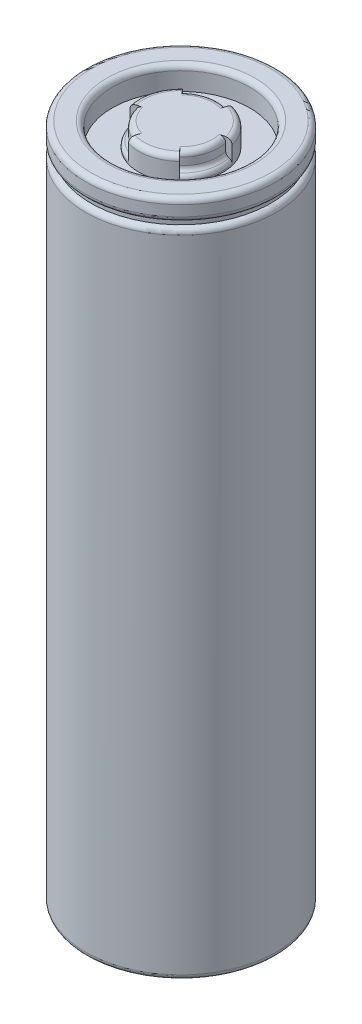
ISO-10303-21;
HEADER;
FILE_DESCRIPTION(('STEP AP214'),'2;1');
FILE_NAME('part.step','',(''),(''),'','','');
FILE_SCHEMA(('AUTOMOTIVE_DESIGN { 1 0 10303 214 1 1 1 1 }'));
ENDSEC;
DATA;
#1=APPLICATION_CONTEXT('core data for automotive mechanical design processes');
#2=APPLICATION_PROTOCOL_DEFINITION('international standard','automotive_design',2000,#1);
#3=PRODUCT_CONTEXT('',#1,'mechanical');
#4=PRODUCT('Part','Part','',(#3));
#5=PRODUCT_RELATED_PRODUCT_CATEGORY('part','',(#4));
#6=PRODUCT_DEFINITION_FORMATION('','',#4);
#7=PRODUCT_DEFINITION_CONTEXT('part definition',#1,'design');
#8=PRODUCT_DEFINITION('design','',#6,#7);
#9=PRODUCT_DEFINITION_SHAPE('','',#8);
#10=(LENGTH_UNIT() NAMED_UNIT(*) SI_UNIT(.MILLI.,.METRE.));
#11=(NAMED_UNIT(*) PLANE_ANGLE_UNIT() SI_UNIT($,.RADIAN.));
#12=(NAMED_UNIT(*) SI_UNIT($,.STERADIAN.) SOLID_ANGLE_UNIT());
#13=UNCERTAINTY_MEASURE_WITH_UNIT(LENGTH_MEASURE(1.E-05),#10,'distance_accuracy_value','');
#14=(GEOMETRIC_REPRESENTATION_CONTEXT(3) GLOBAL_UNCERTAINTY_ASSIGNED_CONTEXT((#13)) GLOBAL_UNIT_ASSIGNED_CONTEXT((#10,
#11,#12)) REPRESENTATION_CONTEXT('',''));
#15=CARTESIAN_POINT('',(0.,0.,0.));
#16=DIRECTION('',(0.,0.,1.));
#17=DIRECTION('',(1.,0.,0.));
#18=AXIS2_PLACEMENT_3D('',#15,#16,#17);
#19=CARTESIAN_POINT('',(-3.1424287856072,-5.68965517241379,0.));
#20=DIRECTION('',(0.,-1.,0.));
#21=DIRECTION('',(0.,0.,-1.));
#22=AXIS2_PLACEMENT_3D('',#19,#20,#21);
#23=PLANE('',#22);
#24=CARTESIAN_POINT('',(-12.1424287856072,-5.68965517241379,0.));
#25=DIRECTION('',(0.,-1.,0.));
#26=DIRECTION('',(0.,0.,-1.));
#27=AXIS2_PLACEMENT_3D('',#24,#25,#26);
#28=CIRCLE('',#27,8.5);
#29=CARTESIAN_POINT('',(-12.1424287856072,-5.68965517241379,-8.5));
#30=VERTEX_POINT('',#29);
#31=EDGE_CURVE('E345',#30,#30,#28,.T.);
#32=ORIENTED_EDGE('',*,*,#31,.T.);
#33=EDGE_LOOP('',(#32));
#34=FACE_BOUND('',#33,.T.);
#35=ADVANCED_FACE('F35',(#34),#23,.T.);
#36=CARTESIAN_POINT('',(-12.1424287856072,58.3103448275862,0.));
#37=DIRECTION('',(0.,1.,0.));
#38=DIRECTION('',(0.,0.,1.));
#39=AXIS2_PLACEMENT_3D('',#36,#37,#38);
#40=PLANE('',#39);
#41=CARTESIAN_POINT('',(-12.1424287856072,58.3103448275862,0.));
#42=DIRECTION('',(0.,1.,0.));
#43=DIRECTION('',(0.,0.,1.));
#44=AXIS2_PLACEMENT_3D('',#41,#42,#43);
#45=CIRCLE('',#44,8.5);
#46=CARTESIAN_POINT('',(-12.1424287856072,58.3103448275862,8.5));
#47=VERTEX_POINT('',#46);
#48=EDGE_CURVE('E363',#47,#47,#45,.T.);
#49=ORIENTED_EDGE('',*,*,#48,.T.);
#50=EDGE_LOOP('',(#49));
#51=FACE_BOUND('',#50,.T.);
#52=CARTESIAN_POINT('',(-12.1424287856072,58.3103448275862,0.));
#53=DIRECTION('',(0.,1.,0.));
#54=DIRECTION('',(0.,0.,1.));
#55=AXIS2_PLACEMENT_3D('',#52,#53,#54);
#56=CIRCLE('',#55,7.);
#57=CARTESIAN_POINT('',(-12.1424287856072,58.3103448275862,7.));
#58=VERTEX_POINT('',#57);
#59=EDGE_CURVE('E360',#58,#58,#56,.F.);
#60=ORIENTED_EDGE('',*,*,#59,.T.);
#61=EDGE_LOOP('',(#60));
#62=FACE_BOUND('',#61,.T.);
#63=ADVANCED_FACE('F459',(#51,#62),#40,.T.);
#64=CARTESIAN_POINT('',(-12.1424287856072,-5.6896551724138,0.));
#65=DIRECTION('',(0.,-1.,0.));
#66=DIRECTION('',(0.,0.,-1.));
#67=AXIS2_PLACEMENT_3D('',#64,#65,#66);
#68=CYLINDRICAL_SURFACE('',#67,9.);
#69=CARTESIAN_POINT('',(-12.1424287856072,57.8103448275862,0.));
#70=DIRECTION('',(0.,1.,0.));
#71=DIRECTION('',(0.,0.,1.));
#72=AXIS2_PLACEMENT_3D('',#69,#70,#71);
#73=CIRCLE('',#72,9.);
#74=CARTESIAN_POINT('',(-12.1424287856072,57.8103448275862,9.));
#75=VERTEX_POINT('',#74);
#76=EDGE_CURVE('E357',#75,#75,#73,.F.);
#77=ORIENTED_EDGE('',*,*,#76,.T.);
#78=EDGE_LOOP('',(#77));
#79=FACE_BOUND('',#78,.T.);
#80=CARTESIAN_POINT('',(-12.1424287856072,56.8103448275862,0.));
#81=DIRECTION('',(0.,-1.,0.));
#82=DIRECTION('',(0.,0.,-1.));
#83=AXIS2_PLACEMENT_3D('',#80,#81,#82);
#84=CIRCLE('',#83,9.);
#85=CARTESIAN_POINT('',(-12.1424287856072,56.8103448275862,-9.));
#86=VERTEX_POINT('',#85);
#87=EDGE_CURVE('E354',#86,#86,#84,.F.);
#88=ORIENTED_EDGE('',*,*,#87,.T.);
#89=EDGE_LOOP('',(#88));
#90=FACE_BOUND('',#89,.T.);
#91=ADVANCED_FACE('F465',(#79,#90),#68,.T.);
#92=CARTESIAN_POINT('',(-12.1424287856072,-5.6896551724138,0.));
#93=DIRECTION('',(0.,-1.,0.));
#94=DIRECTION('',(0.,0.,-1.));
#95=AXIS2_PLACEMENT_3D('',#92,#93,#94);
#96=CYLINDRICAL_SURFACE('',#95,8.5);
#97=CARTESIAN_POINT('',(-12.1424287856072,56.3103448275862,0.));
#98=DIRECTION('',(0.,-1.,0.));
#99=DIRECTION('',(0.,0.,-1.));
#100=AXIS2_PLACEMENT_3D('',#97,#98,#99);
#101=CIRCLE('',#100,8.5);
#102=CARTESIAN_POINT('',(-12.1424287856072,56.3103448275862,-8.5));
#103=VERTEX_POINT('',#102);
#104=EDGE_CURVE('E342',#103,#103,#101,.T.);
#105=ORIENTED_EDGE('',*,*,#104,.T.);
#106=EDGE_LOOP('',(#105));
#107=FACE_BOUND('',#106,.T.);
#108=CARTESIAN_POINT('',(-12.1424287856072,55.8103448275862,0.));
#109=DIRECTION('',(0.,-1.,0.));
#110=DIRECTION('',(0.,0.,-1.));
#111=AXIS2_PLACEMENT_3D('',#108,#109,#110);
#112=CIRCLE('',#111,8.5);
#113=CARTESIAN_POINT('',(-12.1424287856072,55.8103448275862,-8.5));
#114=VERTEX_POINT('',#113);
#115=EDGE_CURVE('E339',#114,#114,#112,.T.);
#116=ORIENTED_EDGE('',*,*,#115,.F.);
#117=EDGE_LOOP('',(#116));
#118=FACE_BOUND('',#117,.T.);
#119=ADVANCED_FACE('F588',(#107,#118),#96,.T.);
#120=CARTESIAN_POINT('',(-12.1424287856072,-5.6896551724138,0.));
#121=DIRECTION('',(0.,-1.,0.));
#122=DIRECTION('',(0.,0.,-1.));
#123=AXIS2_PLACEMENT_3D('',#120,#121,#122);
#124=CYLINDRICAL_SURFACE('',#123,9.);
#125=CARTESIAN_POINT('',(-12.1424287856072,55.3103448275862,0.));
#126=DIRECTION('',(0.,1.,0.));
#127=DIRECTION('',(0.,0.,1.));
#128=AXIS2_PLACEMENT_3D('',#125,#126,#127);
#129=CIRCLE('',#128,9.);
#130=CARTESIAN_POINT('',(-12.1424287856072,55.3103448275862,9.));
#131=VERTEX_POINT('',#130);
#132=EDGE_CURVE('E351',#131,#131,#129,.F.);
#133=ORIENTED_EDGE('',*,*,#132,.T.);
#134=EDGE_LOOP('',(#133));
#135=FACE_BOUND('',#134,.T.);
#136=CARTESIAN_POINT('',(-12.1424287856072,-5.18965517241379,0.));
#137=DIRECTION('',(0.,-1.,0.));
#138=DIRECTION('',(0.,0.,-1.));
#139=AXIS2_PLACEMENT_3D('',#136,#137,#138);
#140=CIRCLE('',#139,9.);
#141=CARTESIAN_POINT('',(-12.1424287856072,-5.18965517241379,-9.));
#142=VERTEX_POINT('',#141);
#143=EDGE_CURVE('E348',#142,#142,#140,.F.);
#144=ORIENTED_EDGE('',*,*,#143,.T.);
#145=EDGE_LOOP('',(#144));
#146=FACE_BOUND('',#145,.T.);
#147=ADVANCED_FACE('F474',(#135,#146),#124,.T.);
#148=CARTESIAN_POINT('',(-12.1424287856072,-5.18965517241379,0.));
#149=DIRECTION('',(0.,-1.,0.));
#150=DIRECTION('',(0.,0.,-1.));
#151=AXIS2_PLACEMENT_3D('',#148,#149,#150);
#152=TOROIDAL_SURFACE('',#151,8.5,0.5);
#153=ORIENTED_EDGE('',*,*,#143,.F.);
#154=EDGE_LOOP('',(#153));
#155=FACE_BOUND('',#154,.T.);
#156=ORIENTED_EDGE('',*,*,#31,.F.);
#157=EDGE_LOOP('',(#156));
#158=FACE_BOUND('',#157,.T.);
#159=ADVANCED_FACE('F470',(#155,#158),#152,.T.);
#160=CARTESIAN_POINT('',(-12.1424287856072,55.3103448275862,0.));
#161=DIRECTION('',(0.,1.,0.));
#162=DIRECTION('',(0.,0.,1.));
#163=AXIS2_PLACEMENT_3D('',#160,#161,#162);
#164=TOROIDAL_SURFACE('',#163,8.5,0.5);
#165=ORIENTED_EDGE('',*,*,#115,.T.);
#166=EDGE_LOOP('',(#165));
#167=FACE_BOUND('',#166,.T.);
#168=ORIENTED_EDGE('',*,*,#132,.F.);
#169=EDGE_LOOP('',(#168));
#170=FACE_BOUND('',#169,.T.);
#171=ADVANCED_FACE('F473',(#167,#170),#164,.T.);
#172=CARTESIAN_POINT('',(-12.1424287856072,56.8103448275862,0.));
#173=DIRECTION('',(0.,-1.,0.));
#174=DIRECTION('',(0.,0.,-1.));
#175=AXIS2_PLACEMENT_3D('',#172,#173,#174);
#176=TOROIDAL_SURFACE('',#175,8.5,0.5);
#177=ORIENTED_EDGE('',*,*,#87,.F.);
#178=EDGE_LOOP('',(#177));
#179=FACE_BOUND('',#178,.T.);
#180=ORIENTED_EDGE('',*,*,#104,.F.);
#181=EDGE_LOOP('',(#180));
#182=FACE_BOUND('',#181,.T.);
#183=ADVANCED_FACE('F478',(#179,#182),#176,.T.);
#184=CARTESIAN_POINT('',(-12.1424287856072,56.1103448275862,0.));
#185=DIRECTION('',(0.,1.,0.));
#186=DIRECTION('',(0.,0.,1.));
#187=AXIS2_PLACEMENT_3D('',#184,#185,#186);
#188=CYLINDRICAL_SURFACE('',#187,6.5);
#189=CARTESIAN_POINT('',(-12.1424287856072,57.8103448275862,0.));
#190=DIRECTION('',(0.,1.,0.));
#191=DIRECTION('',(0.,0.,1.));
#192=AXIS2_PLACEMENT_3D('',#189,#190,#191);
#193=CIRCLE('',#192,6.5);
#194=CARTESIAN_POINT('',(-12.1424287856072,57.8103448275862,6.5));
#195=VERTEX_POINT('',#194);
#196=EDGE_CURVE('E366',#195,#195,#193,.T.);
#197=ORIENTED_EDGE('',*,*,#196,.T.);
#198=EDGE_LOOP('',(#197));
#199=FACE_BOUND('',#198,.T.);
#200=CARTESIAN_POINT('',(-12.1424287856072,56.1103448275862,0.));
#201=DIRECTION('',(0.,1.,0.));
#202=DIRECTION('',(0.,0.,1.));
#203=AXIS2_PLACEMENT_3D('',#200,#201,#202);
#204=CIRCLE('',#203,6.5);
#205=CARTESIAN_POINT('',(-12.1424287856072,56.1103448275862,6.5));
#206=VERTEX_POINT('',#205);
#207=EDGE_CURVE('E336',#206,#206,#204,.T.);
#208=ORIENTED_EDGE('',*,*,#207,.F.);
#209=EDGE_LOOP('',(#208));
#210=FACE_BOUND('',#209,.T.);
#211=ADVANCED_FACE('F482',(#199,#210),#188,.F.);
#212=CARTESIAN_POINT('',(-12.1424287856072,56.1103448275862,0.));
#213=DIRECTION('',(0.,1.,0.));
#214=DIRECTION('',(0.,0.,1.));
#215=AXIS2_PLACEMENT_3D('',#212,#213,#214);
#216=PLANE('',#215);
#217=CARTESIAN_POINT('',(-12.1424287856072,56.1103448275862,0.));
#218=DIRECTION('',(0.,1.,0.));
#219=DIRECTION('',(0.,0.,1.));
#220=AXIS2_PLACEMENT_3D('',#217,#218,#219);
#221=CIRCLE('',#220,4.);
#222=CARTESIAN_POINT('',(-12.1424287856072,56.1103448275862,4.));
#223=VERTEX_POINT('',#222);
#224=EDGE_CURVE('E325',#223,#223,#221,.T.);
#225=ORIENTED_EDGE('',*,*,#224,.F.);
#226=EDGE_LOOP('',(#225));
#227=FACE_BOUND('',#226,.T.);
#228=ORIENTED_EDGE('',*,*,#207,.T.);
#229=EDGE_LOOP('',(#228));
#230=FACE_BOUND('',#229,.T.);
#231=ADVANCED_FACE('F566',(#227,#230),#216,.T.);
#232=CARTESIAN_POINT('',(-12.1424287856072,69.624053326571,0.));
#233=DIRECTION('',(0.,-1.,0.));
#234=DIRECTION('',(0.,0.,-1.));
#235=AXIS2_PLACEMENT_3D('',#232,#233,#234);
#236=CYLINDRICAL_SURFACE('',#235,4.);
#237=CARTESIAN_POINT('',(-12.1424287856072,56.2443194238015,0.));
#238=DIRECTION('',(0.,1.,0.));
#239=DIRECTION('',(0.,0.,1.));
#240=AXIS2_PLACEMENT_3D('',#237,#238,#239);
#241=CIRCLE('',#240,4.);
#242=CARTESIAN_POINT('',(-8.25454744926253,56.2443194238015,-0.940414118621564));
#243=VERTEX_POINT('',#242);
#244=CARTESIAN_POINT('',(-9.38406560063104,56.2443194238015,2.8967969448631));
#245=VERTEX_POINT('',#244);
#246=EDGE_CURVE('E288',#243,#245,#241,.F.);
#247=ORIENTED_EDGE('',*,*,#246,.T.);
#248=DIRECTION('',(0.,1.,0.));
#249=VECTOR('',#248,1.);
#250=CARTESIAN_POINT('',(-9.38406560063104,56.6103448275862,2.8967969448631));
#251=LINE('',#250,#249);
#252=CARTESIAN_POINT('',(-9.38406560063104,57.8103448275862,2.8967969448631));
#253=VERTEX_POINT('',#252);
#254=EDGE_CURVE('E323',#245,#253,#251,.T.);
#255=ORIENTED_EDGE('',*,*,#254,.T.);
#256=CARTESIAN_POINT('',(-12.1424287856072,57.8103448275862,0.));
#257=DIRECTION('',(0.,1.,0.));
#258=DIRECTION('',(0.,0.,1.));
#259=AXIS2_PLACEMENT_3D('',#256,#257,#258);
#260=CIRCLE('',#259,4.);
#261=CARTESIAN_POINT('',(-13.2719469369757,57.8103448275862,3.83721106348467));
#262=VERTEX_POINT('',#261);
#263=EDGE_CURVE('E229',#253,#262,#260,.F.);
#264=ORIENTED_EDGE('',*,*,#263,.T.);
#265=DIRECTION('',(0.,1.,0.));
#266=VECTOR('',#265,1.);
#267=CARTESIAN_POINT('',(-13.2719469369757,56.6103448275862,3.83721106348467));
#268=LINE('',#267,#266);
#269=CARTESIAN_POINT('',(-13.2719469369757,56.2443194238015,3.83721106348467));
#270=VERTEX_POINT('',#269);
#271=EDGE_CURVE('E186',#270,#262,#268,.T.);
#272=ORIENTED_EDGE('',*,*,#271,.F.);
#273=CARTESIAN_POINT('',(-12.1424287856072,56.2443194238015,0.));
#274=DIRECTION('',(0.,1.,0.));
#275=DIRECTION('',(0.,0.,1.));
#276=AXIS2_PLACEMENT_3D('',#273,#274,#275);
#277=CIRCLE('',#276,4.);
#278=CARTESIAN_POINT('',(-16.0303101219519,56.2443194238015,0.940414118621601));
#279=VERTEX_POINT('',#278);
#280=EDGE_CURVE('E285',#270,#279,#277,.F.);
#281=ORIENTED_EDGE('',*,*,#280,.T.);
#282=DIRECTION('',(0.,1.,0.));
#283=VECTOR('',#282,1.);
#284=CARTESIAN_POINT('',(-16.0303101219519,56.6103448275862,0.940414118621601));
#285=LINE('',#284,#283);
#286=CARTESIAN_POINT('',(-16.0303101219519,57.8103448275862,0.940414118621601));
#287=VERTEX_POINT('',#286);
#288=EDGE_CURVE('E314',#279,#287,#285,.T.);
#289=ORIENTED_EDGE('',*,*,#288,.T.);
#290=CARTESIAN_POINT('',(-12.1424287856072,57.8103448275862,0.));
#291=DIRECTION('',(0.,1.,0.));
#292=DIRECTION('',(0.,0.,1.));
#293=AXIS2_PLACEMENT_3D('',#290,#291,#292);
#294=CIRCLE('',#293,4.);
#295=CARTESIAN_POINT('',(-14.9007919705834,57.8103448275862,-2.89679694486308));
#296=VERTEX_POINT('',#295);
#297=EDGE_CURVE('E227',#287,#296,#294,.F.);
#298=ORIENTED_EDGE('',*,*,#297,.T.);
#299=DIRECTION('',(0.,1.,0.));
#300=VECTOR('',#299,1.);
#301=CARTESIAN_POINT('',(-14.9007919705834,56.6103448275862,-2.89679694486308));
#302=LINE('',#301,#300);
#303=CARTESIAN_POINT('',(-14.9007919705834,56.2443194238015,-2.89679694486308));
#304=VERTEX_POINT('',#303);
#305=EDGE_CURVE('E391',#304,#296,#302,.T.);
#306=ORIENTED_EDGE('',*,*,#305,.F.);
#307=CARTESIAN_POINT('',(-12.1424287856072,56.2443194238015,0.));
#308=DIRECTION('',(0.,1.,0.));
#309=DIRECTION('',(0.,0.,1.));
#310=AXIS2_PLACEMENT_3D('',#307,#308,#309);
#311=CIRCLE('',#310,4.);
#312=CARTESIAN_POINT('',(-11.0129106342387,56.2443194238015,-3.83721106348466));
#313=VERTEX_POINT('',#312);
#314=EDGE_CURVE('E282',#304,#313,#311,.F.);
#315=ORIENTED_EDGE('',*,*,#314,.T.);
#316=DIRECTION('',(0.,1.,0.));
#317=VECTOR('',#316,1.);
#318=CARTESIAN_POINT('',(-11.0129106342387,56.6103448275862,-3.83721106348467));
#319=LINE('',#318,#317);
#320=CARTESIAN_POINT('',(-11.0129106342387,57.8103448275862,-3.83721106348467));
#321=VERTEX_POINT('',#320);
#322=EDGE_CURVE('E333',#313,#321,#319,.T.);
#323=ORIENTED_EDGE('',*,*,#322,.T.);
#324=CARTESIAN_POINT('',(-12.1424287856072,57.8103448275862,0.));
#325=DIRECTION('',(0.,1.,0.));
#326=DIRECTION('',(0.,0.,1.));
#327=AXIS2_PLACEMENT_3D('',#324,#325,#326);
#328=CIRCLE('',#327,4.);
#329=CARTESIAN_POINT('',(-8.25454744926253,57.8103448275862,-0.940414118621564));
#330=VERTEX_POINT('',#329);
#331=EDGE_CURVE('E231',#321,#330,#328,.F.);
#332=ORIENTED_EDGE('',*,*,#331,.T.);
#333=DIRECTION('',(0.,1.,0.));
#334=VECTOR('',#333,1.);
#335=CARTESIAN_POINT('',(-8.25454744926253,56.6103448275862,-0.940414118621564));
#336=LINE('',#335,#334);
#337=EDGE_CURVE('E330',#243,#330,#336,.T.);
#338=ORIENTED_EDGE('',*,*,#337,.F.);
#339=EDGE_LOOP('',(#247,#255,#264,#272,#281,#289,#298,#306,#315,#323,#332,#338));
#340=FACE_BOUND('',#339,.T.);
#341=ORIENTED_EDGE('',*,*,#224,.T.);
#342=EDGE_LOOP('',(#341));
#343=FACE_BOUND('',#342,.T.);
#344=ADVANCED_FACE('F312',(#340,#343),#236,.T.);
#345=CARTESIAN_POINT('',(-12.1424287856072,58.3103448275862,0.));
#346=DIRECTION('',(0.,1.,0.));
#347=DIRECTION('',(0.,0.,1.));
#348=AXIS2_PLACEMENT_3D('',#345,#346,#347);
#349=PLANE('',#348);
#350=DIRECTION('',(0.971970334086168,0.,-0.23510352965539));
#351=VECTOR('',#350,1.);
#352=CARTESIAN_POINT('',(-12.1424287856072,58.3103448275862,0.));
#353=LINE('',#352,#351);
#354=CARTESIAN_POINT('',(-9.2265177833487,58.3103448275862,-0.705310588966171));
#355=VERTEX_POINT('',#354);
#356=CARTESIAN_POINT('',(-8.74053261630562,58.3103448275862,-0.822862353793869));
#357=VERTEX_POINT('',#356);
#358=EDGE_CURVE('E217',#355,#357,#353,.T.);
#359=ORIENTED_EDGE('',*,*,#358,.T.);
#360=CARTESIAN_POINT('',(-12.1424287856072,58.3103448275862,0.));
#361=DIRECTION('',(0.,1.,0.));
#362=DIRECTION('',(0.,0.,1.));
#363=AXIS2_PLACEMENT_3D('',#360,#361,#362);
#364=CIRCLE('',#363,3.5);
#365=CARTESIAN_POINT('',(-11.1541004031598,58.3103448275862,-3.35755968054908));
#366=VERTEX_POINT('',#365);
#367=EDGE_CURVE('E219',#357,#366,#364,.T.);
#368=ORIENTED_EDGE('',*,*,#367,.T.);
#369=DIRECTION('',(0.282379537842125,0.,-0.959302765871165));
#370=VECTOR('',#369,1.);
#371=CARTESIAN_POINT('',(-12.1424287856072,58.3103448275862,0.));
#372=LINE('',#371,#370);
#373=CARTESIAN_POINT('',(-11.2952901720808,58.3103448275862,-2.8779082976135));
#374=VERTEX_POINT('',#373);
#375=EDGE_CURVE('E214',#366,#374,#372,.F.);
#376=ORIENTED_EDGE('',*,*,#375,.T.);
#377=CARTESIAN_POINT('',(-12.1424287856072,58.3103448275862,0.));
#378=DIRECTION('',(0.,1.,0.));
#379=DIRECTION('',(0.,0.,1.));
#380=AXIS2_PLACEMENT_3D('',#377,#378,#379);
#381=CIRCLE('',#380,3.);
#382=CARTESIAN_POINT('',(-14.2112011743393,58.3103448275862,-2.17259770864731));
#383=VERTEX_POINT('',#382);
#384=EDGE_CURVE('E202',#374,#383,#381,.T.);
#385=ORIENTED_EDGE('',*,*,#384,.T.);
#386=DIRECTION('',(-0.689590796244044,0.,-0.724199236215771));
#387=VECTOR('',#386,1.);
#388=CARTESIAN_POINT('',(-12.1424287856072,58.3103448275862,0.));
#389=LINE('',#388,#387);
#390=CARTESIAN_POINT('',(-14.5559965724614,58.3103448275862,-2.53469732675519));
#391=VERTEX_POINT('',#390);
#392=EDGE_CURVE('E375',#383,#391,#389,.T.);
#393=ORIENTED_EDGE('',*,*,#392,.T.);
#394=CARTESIAN_POINT('',(-12.1424287856072,58.3103448275862,0.));
#395=DIRECTION('',(0.,1.,0.));
#396=DIRECTION('',(0.,0.,1.));
#397=AXIS2_PLACEMENT_3D('',#394,#395,#396);
#398=CIRCLE('',#397,3.5);
#399=CARTESIAN_POINT('',(-15.5443249549088,58.3103448275862,0.822862353793903));
#400=VERTEX_POINT('',#399);
#401=EDGE_CURVE('E369',#391,#400,#398,.T.);
#402=ORIENTED_EDGE('',*,*,#401,.T.);
#403=DIRECTION('',(-0.971970334086166,0.,0.235103529655398));
#404=VECTOR('',#403,1.);
#405=CARTESIAN_POINT('',(-12.1424287856072,58.3103448275862,0.));
#406=LINE('',#405,#404);
#407=CARTESIAN_POINT('',(-15.0583397878657,58.3103448275862,0.705310588966193));
#408=VERTEX_POINT('',#407);
#409=EDGE_CURVE('E372',#400,#408,#406,.F.);
#410=ORIENTED_EDGE('',*,*,#409,.T.);
#411=CARTESIAN_POINT('',(-12.1424287856072,58.3103448275862,0.));
#412=DIRECTION('',(0.,1.,0.));
#413=DIRECTION('',(0.,0.,1.));
#414=AXIS2_PLACEMENT_3D('',#411,#412,#413);
#415=CIRCLE('',#414,3.);
#416=CARTESIAN_POINT('',(-12.9895673991336,58.3103448275862,2.8779082976135));
#417=VERTEX_POINT('',#416);
#418=EDGE_CURVE('E201',#408,#417,#415,.T.);
#419=ORIENTED_EDGE('',*,*,#418,.T.);
#420=DIRECTION('',(-0.282379537842119,0.,0.959302765871167));
#421=VECTOR('',#420,1.);
#422=CARTESIAN_POINT('',(-12.1424287856072,58.3103448275862,0.));
#423=LINE('',#422,#421);
#424=CARTESIAN_POINT('',(-13.1307571680546,58.3103448275862,3.35755968054909));
#425=VERTEX_POINT('',#424);
#426=EDGE_CURVE('E183',#417,#425,#423,.T.);
#427=ORIENTED_EDGE('',*,*,#426,.T.);
#428=CARTESIAN_POINT('',(-12.1424287856072,58.3103448275862,0.));
#429=DIRECTION('',(0.,1.,0.));
#430=DIRECTION('',(0.,0.,1.));
#431=AXIS2_PLACEMENT_3D('',#428,#429,#430);
#432=CIRCLE('',#431,3.5);
#433=CARTESIAN_POINT('',(-9.72886099875306,58.3103448275862,2.53469732675521));
#434=VERTEX_POINT('',#433);
#435=EDGE_CURVE('E198',#425,#434,#432,.T.);
#436=ORIENTED_EDGE('',*,*,#435,.T.);
#437=DIRECTION('',(0.689590796244039,0.,0.724199236215775));
#438=VECTOR('',#437,1.);
#439=CARTESIAN_POINT('',(-12.1424287856072,58.3103448275862,0.));
#440=LINE('',#439,#438);
#441=CARTESIAN_POINT('',(-10.0736563968751,58.3103448275862,2.17259770864733));
#442=VERTEX_POINT('',#441);
#443=EDGE_CURVE('E206',#434,#442,#440,.F.);
#444=ORIENTED_EDGE('',*,*,#443,.T.);
#445=CARTESIAN_POINT('',(-12.1424287856072,58.3103448275862,0.));
#446=DIRECTION('',(0.,1.,0.));
#447=DIRECTION('',(0.,0.,1.));
#448=AXIS2_PLACEMENT_3D('',#445,#446,#447);
#449=CIRCLE('',#448,3.);
#450=EDGE_CURVE('E208',#442,#355,#449,.T.);
#451=ORIENTED_EDGE('',*,*,#450,.T.);
#452=EDGE_LOOP('',(#359,#368,#376,#385,#393,#402,#410,#419,#427,#436,#444,#451));
#453=FACE_BOUND('',#452,.T.);
#454=ADVANCED_FACE('F196',(#453),#349,.T.);
#455=CARTESIAN_POINT('',(-12.1424287856072,57.8103448275862,0.));
#456=DIRECTION('',(0.,1.,0.));
#457=DIRECTION('',(0.,0.,1.));
#458=AXIS2_PLACEMENT_3D('',#455,#456,#457);
#459=TOROIDAL_SURFACE('',#458,8.5,0.5);
#460=ORIENTED_EDGE('',*,*,#48,.F.);
#461=EDGE_LOOP('',(#460));
#462=FACE_BOUND('',#461,.T.);
#463=ORIENTED_EDGE('',*,*,#76,.F.);
#464=EDGE_LOOP('',(#463));
#465=FACE_BOUND('',#464,.T.);
#466=ADVANCED_FACE('F454',(#462,#465),#459,.T.);
#467=CARTESIAN_POINT('',(-12.1424287856072,57.8103448275862,0.));
#468=DIRECTION('',(0.,1.,0.));
#469=DIRECTION('',(0.,0.,1.));
#470=AXIS2_PLACEMENT_3D('',#467,#468,#469);
#471=TOROIDAL_SURFACE('',#470,7.,0.5);
#472=ORIENTED_EDGE('',*,*,#59,.F.);
#473=EDGE_LOOP('',(#472));
#474=FACE_BOUND('',#473,.T.);
#475=ORIENTED_EDGE('',*,*,#196,.F.);
#476=EDGE_LOOP('',(#475));
#477=FACE_BOUND('',#476,.T.);
#478=ADVANCED_FACE('F447',(#474,#477),#471,.T.);
#479=CARTESIAN_POINT('',(-6.36827325146014,56.6103448275862,6.06394263147989));
#480=DIRECTION('',(-0.724199236215775,0.,0.689590796244039));
#481=DIRECTION('',(0.689590796244039,0.,0.724199236215775));
#482=AXIS2_PLACEMENT_3D('',#479,#480,#481);
#483=PLANE('',#482);
#484=ORIENTED_EDGE('',*,*,#254,.F.);
#485=CARTESIAN_POINT('',(-9.72886099875301,56.2443194238015,2.53469732675527));
#486=DIRECTION('',(-0.724199236215775,0.,0.689590796244039));
#487=DIRECTION('',(0.689590796244039,0.,0.724199236215775));
#488=AXIS2_PLACEMENT_3D('',#485,#486,#487);
#489=CIRCLE('',#488,0.5);
#490=CARTESIAN_POINT('',(-9.556463299692,56.6773321256939,2.71574713580921));
#491=VERTEX_POINT('',#490);
#492=EDGE_CURVE('E296',#245,#491,#489,.T.);
#493=ORIENTED_EDGE('',*,*,#492,.T.);
#494=CARTESIAN_POINT('',(-9.38406560063105,57.1103448275862,2.8967969448631));
#495=DIRECTION('',(-0.724199236215775,0.,0.689590796244039));
#496=DIRECTION('',(0.689590796244039,0.,0.724199236215775));
#497=AXIS2_PLACEMENT_3D('',#494,#495,#496);
#498=CIRCLE('',#497,0.5);
#499=CARTESIAN_POINT('',(-9.72886099875306,57.1103448275862,2.53469732675521));
#500=VERTEX_POINT('',#499);
#501=EDGE_CURVE('E272',#491,#500,#498,.F.);
#502=ORIENTED_EDGE('',*,*,#501,.T.);
#503=DIRECTION('',(0.,1.,0.));
#504=VECTOR('',#503,1.);
#505=CARTESIAN_POINT('',(-9.72886099875306,56.6103448275862,2.53469732675521));
#506=LINE('',#505,#504);
#507=CARTESIAN_POINT('',(-9.72886099875306,57.8103448275862,2.53469732675521));
#508=VERTEX_POINT('',#507);
#509=EDGE_CURVE('E326',#500,#508,#506,.T.);
#510=ORIENTED_EDGE('',*,*,#509,.T.);
#511=CARTESIAN_POINT('',(-10.0736563968751,57.8103448275862,2.17259770864733));
#512=DIRECTION('',(-0.724199236215775,0.,0.689590796244039));
#513=DIRECTION('',(0.689590796244039,0.,0.724199236215775));
#514=AXIS2_PLACEMENT_3D('',#511,#512,#513);
#515=CIRCLE('',#514,0.5);
#516=EDGE_CURVE('E253',#508,#442,#515,.T.);
#517=ORIENTED_EDGE('',*,*,#516,.T.);
#518=ORIENTED_EDGE('',*,*,#443,.F.);
#519=CARTESIAN_POINT('',(-9.72886099875307,57.8103448275862,2.53469732675521));
#520=DIRECTION('',(-0.724199236215775,0.,0.689590796244039));
#521=DIRECTION('',(0.689590796244039,0.,0.724199236215775));
#522=AXIS2_PLACEMENT_3D('',#519,#520,#521);
#523=CIRCLE('',#522,0.5);
#524=EDGE_CURVE('E191',#434,#253,#523,.F.);
#525=ORIENTED_EDGE('',*,*,#524,.T.);
#526=EDGE_LOOP('',(#484,#493,#502,#510,#517,#518,#525));
#527=FACE_BOUND('',#526,.T.);
#528=ADVANCED_FACE('F445',(#527),#483,.F.);
#529=CARTESIAN_POINT('',(-12.1424287856072,56.6103448275862,0.));
#530=DIRECTION('',(0.,1.,0.));
#531=DIRECTION('',(0.,0.,1.));
#532=AXIS2_PLACEMENT_3D('',#529,#530,#531);
#533=CYLINDRICAL_SURFACE('',#532,3.5);
#534=ORIENTED_EDGE('',*,*,#509,.F.);
#535=CARTESIAN_POINT('',(-12.1424287856072,57.1103448275862,0.));
#536=DIRECTION('',(0.,1.,0.));
#537=DIRECTION('',(0.,0.,1.));
#538=AXIS2_PLACEMENT_3D('',#535,#536,#537);
#539=CIRCLE('',#538,3.5);
#540=CARTESIAN_POINT('',(-8.74053261630562,57.1103448275862,-0.822862353793869));
#541=VERTEX_POINT('',#540);
#542=EDGE_CURVE('E266',#500,#541,#539,.T.);
#543=ORIENTED_EDGE('',*,*,#542,.T.);
#544=DIRECTION('',(0.,1.,0.));
#545=VECTOR('',#544,1.);
#546=CARTESIAN_POINT('',(-8.74053261630562,56.6103448275862,-0.822862353793869));
#547=LINE('',#546,#545);
#548=CARTESIAN_POINT('',(-8.74053261630562,57.8103448275862,-0.822862353793869));
#549=VERTEX_POINT('',#548);
#550=EDGE_CURVE('E328',#541,#549,#547,.T.);
#551=ORIENTED_EDGE('',*,*,#550,.T.);
#552=CARTESIAN_POINT('',(-12.1424287856072,57.8103448275862,0.));
#553=DIRECTION('',(0.,1.,0.));
#554=DIRECTION('',(0.,0.,1.));
#555=AXIS2_PLACEMENT_3D('',#552,#553,#554);
#556=CIRCLE('',#555,3.5);
#557=EDGE_CURVE('E235',#549,#508,#556,.F.);
#558=ORIENTED_EDGE('',*,*,#557,.T.);
#559=EDGE_LOOP('',(#534,#543,#551,#558));
#560=FACE_BOUND('',#559,.T.);
#561=ADVANCED_FACE('F434',(#560),#533,.T.);
#562=CARTESIAN_POINT('',(-0.671156597522295,56.6103448275862,-2.77471079772419));
#563=DIRECTION('',(0.23510352965539,0.,0.971970334086168));
#564=DIRECTION('',(0.971970334086168,0.,-0.23510352965539));
#565=AXIS2_PLACEMENT_3D('',#562,#563,#564);
#566=PLANE('',#565);
#567=ORIENTED_EDGE('',*,*,#550,.F.);
#568=CARTESIAN_POINT('',(-8.25454744926253,57.1103448275862,-0.940414118621562));
#569=DIRECTION('',(0.23510352965539,0.,0.971970334086168));
#570=DIRECTION('',(0.971970334086168,0.,-0.23510352965539));
#571=AXIS2_PLACEMENT_3D('',#568,#569,#570);
#572=CIRCLE('',#571,0.5);
#573=CARTESIAN_POINT('',(-8.497540032784,56.6773321256939,-0.881638236207732));
#574=VERTEX_POINT('',#573);
#575=EDGE_CURVE('E269',#541,#574,#572,.T.);
#576=ORIENTED_EDGE('',*,*,#575,.T.);
#577=CARTESIAN_POINT('',(-8.74053261630554,56.2443194238015,-0.822862353793885));
#578=DIRECTION('',(0.23510352965539,0.,0.971970334086168));
#579=DIRECTION('',(0.971970334086168,0.,-0.23510352965539));
#580=AXIS2_PLACEMENT_3D('',#577,#578,#579);
#581=CIRCLE('',#580,0.5);
#582=EDGE_CURVE('E298',#574,#243,#581,.F.);
#583=ORIENTED_EDGE('',*,*,#582,.T.);
#584=ORIENTED_EDGE('',*,*,#337,.T.);
#585=CARTESIAN_POINT('',(-8.74053261630561,57.8103448275862,-0.822862353793867));
#586=DIRECTION('',(0.23510352965539,0.,0.971970334086168));
#587=DIRECTION('',(0.971970334086168,0.,-0.23510352965539));
#588=AXIS2_PLACEMENT_3D('',#585,#586,#587);
#589=CIRCLE('',#588,0.5);
#590=EDGE_CURVE('E233',#330,#357,#589,.T.);
#591=ORIENTED_EDGE('',*,*,#590,.T.);
#592=ORIENTED_EDGE('',*,*,#358,.F.);
#593=CARTESIAN_POINT('',(-9.2265177833487,57.8103448275862,-0.705310588966171));
#594=DIRECTION('',(0.23510352965539,0.,0.971970334086168));
#595=DIRECTION('',(0.971970334086168,0.,-0.23510352965539));
#596=AXIS2_PLACEMENT_3D('',#593,#594,#595);
#597=CIRCLE('',#596,0.5);
#598=EDGE_CURVE('E250',#355,#549,#597,.F.);
#599=ORIENTED_EDGE('',*,*,#598,.T.);
#600=EDGE_LOOP('',(#567,#576,#583,#584,#591,#592,#599));
#601=FACE_BOUND('',#600,.T.);
#602=ADVANCED_FACE('F425',(#601),#566,.T.);
#603=CARTESIAN_POINT('',(-20.2810349186338,56.6103448275862,1.968594062234));
#604=DIRECTION('',(-0.235103529655398,0.,-0.971970334086166));
#605=DIRECTION('',(-0.971970334086166,0.,0.235103529655398));
#606=AXIS2_PLACEMENT_3D('',#603,#604,#605);
#607=PLANE('',#606);
#608=ORIENTED_EDGE('',*,*,#288,.F.);
#609=CARTESIAN_POINT('',(-15.5443249549089,56.2443194238015,0.822862353793911));
#610=DIRECTION('',(-0.235103529655398,0.,-0.971970334086166));
#611=DIRECTION('',(-0.971970334086166,0.,0.235103529655398));
#612=AXIS2_PLACEMENT_3D('',#609,#610,#611);
#613=CIRCLE('',#612,0.5);
#614=CARTESIAN_POINT('',(-15.7873175384304,56.6773321256939,0.88163823620776));
#615=VERTEX_POINT('',#614);
#616=EDGE_CURVE('E301',#279,#615,#613,.T.);
#617=ORIENTED_EDGE('',*,*,#616,.T.);
#618=CARTESIAN_POINT('',(-16.0303101219519,57.1103448275862,0.940414118621591));
#619=DIRECTION('',(-0.235103529655398,0.,-0.971970334086166));
#620=DIRECTION('',(-0.971970334086166,0.,0.235103529655398));
#621=AXIS2_PLACEMENT_3D('',#618,#619,#620);
#622=CIRCLE('',#621,0.5);
#623=CARTESIAN_POINT('',(-15.5443249549088,57.1103448275862,0.822862353793903));
#624=VERTEX_POINT('',#623);
#625=EDGE_CURVE('E280',#615,#624,#622,.F.);
#626=ORIENTED_EDGE('',*,*,#625,.T.);
#627=DIRECTION('',(0.,1.,0.));
#628=VECTOR('',#627,1.);
#629=CARTESIAN_POINT('',(-15.5443249549088,56.6103448275862,0.822862353793903));
#630=LINE('',#629,#628);
#631=CARTESIAN_POINT('',(-15.5443249549088,57.8103448275862,0.822862353793903));
#632=VERTEX_POINT('',#631);
#633=EDGE_CURVE('E319',#624,#632,#630,.T.);
#634=ORIENTED_EDGE('',*,*,#633,.T.);
#635=CARTESIAN_POINT('',(-15.0583397878657,57.8103448275862,0.705310588966193));
#636=DIRECTION('',(-0.235103529655398,0.,-0.971970334086166));
#637=DIRECTION('',(-0.971970334086166,0.,0.235103529655398));
#638=AXIS2_PLACEMENT_3D('',#635,#636,#637);
#639=CIRCLE('',#638,0.5);
#640=EDGE_CURVE('E257',#632,#408,#639,.T.);
#641=ORIENTED_EDGE('',*,*,#640,.T.);
#642=ORIENTED_EDGE('',*,*,#409,.F.);
#643=CARTESIAN_POINT('',(-15.5443249549088,57.8103448275862,0.822862353793893));
#644=DIRECTION('',(-0.235103529655398,0.,-0.971970334086166));
#645=DIRECTION('',(-0.971970334086166,0.,0.235103529655398));
#646=AXIS2_PLACEMENT_3D('',#643,#644,#645);
#647=CIRCLE('',#646,0.5);
#648=EDGE_CURVE('E241',#400,#287,#647,.F.);
#649=ORIENTED_EDGE('',*,*,#648,.T.);
#650=EDGE_LOOP('',(#608,#617,#626,#634,#641,#642,#649));
#651=FACE_BOUND('',#650,.T.);
#652=ADVANCED_FACE('F407',(#651),#607,.F.);
#653=CARTESIAN_POINT('',(-12.1424287856072,56.6103448275862,0.));
#654=DIRECTION('',(0.,1.,0.));
#655=DIRECTION('',(0.,0.,1.));
#656=AXIS2_PLACEMENT_3D('',#653,#654,#655);
#657=CYLINDRICAL_SURFACE('',#656,3.5);
#658=ORIENTED_EDGE('',*,*,#633,.F.);
#659=CARTESIAN_POINT('',(-12.1424287856072,57.1103448275862,0.));
#660=DIRECTION('',(0.,1.,0.));
#661=DIRECTION('',(0.,0.,1.));
#662=AXIS2_PLACEMENT_3D('',#659,#660,#661);
#663=CIRCLE('',#662,3.5);
#664=CARTESIAN_POINT('',(-13.1307571680546,57.1103448275862,3.35755968054909));
#665=VERTEX_POINT('',#664);
#666=EDGE_CURVE('E274',#624,#665,#663,.T.);
#667=ORIENTED_EDGE('',*,*,#666,.T.);
#668=DIRECTION('',(0.,1.,0.));
#669=VECTOR('',#668,1.);
#670=CARTESIAN_POINT('',(-13.1307571680546,56.6103448275862,3.35755968054909));
#671=LINE('',#670,#669);
#672=CARTESIAN_POINT('',(-13.1307571680546,57.8103448275862,3.35755968054909));
#673=VERTEX_POINT('',#672);
#674=EDGE_CURVE('E317',#665,#673,#671,.T.);
#675=ORIENTED_EDGE('',*,*,#674,.T.);
#676=CARTESIAN_POINT('',(-12.1424287856072,57.8103448275862,0.));
#677=DIRECTION('',(0.,1.,0.));
#678=DIRECTION('',(0.,0.,1.));
#679=AXIS2_PLACEMENT_3D('',#676,#677,#678);
#680=CIRCLE('',#679,3.5);
#681=EDGE_CURVE('E190',#673,#632,#680,.F.);
#682=ORIENTED_EDGE('',*,*,#681,.T.);
#683=EDGE_LOOP('',(#658,#667,#675,#682));
#684=FACE_BOUND('',#683,.T.);
#685=ADVANCED_FACE('F402',(#684),#657,.T.);
#686=CARTESIAN_POINT('',(-15.4750948406654,56.6103448275862,11.3217685274696));
#687=DIRECTION('',(-0.959302765871167,0.,-0.282379537842119));
#688=DIRECTION('',(-0.282379537842119,0.,0.959302765871167));
#689=AXIS2_PLACEMENT_3D('',#686,#687,#688);
#690=PLANE('',#689);
#691=ORIENTED_EDGE('',*,*,#674,.F.);
#692=CARTESIAN_POINT('',(-13.2719469369757,57.1103448275862,3.83721106348467));
#693=DIRECTION('',(-0.959302765871167,0.,-0.282379537842119));
#694=DIRECTION('',(-0.282379537842119,0.,0.959302765871167));
#695=AXIS2_PLACEMENT_3D('',#692,#693,#694);
#696=CIRCLE('',#695,0.5);
#697=CARTESIAN_POINT('',(-13.2013520525152,56.6773321256939,3.59738537201695));
#698=VERTEX_POINT('',#697);
#699=EDGE_CURVE('E277',#665,#698,#696,.T.);
#700=ORIENTED_EDGE('',*,*,#699,.T.);
#701=CARTESIAN_POINT('',(-13.1307571680546,56.2443194238015,3.35755968054916));
#702=DIRECTION('',(-0.959302765871167,0.,-0.282379537842119));
#703=DIRECTION('',(-0.282379537842119,0.,0.959302765871167));
#704=AXIS2_PLACEMENT_3D('',#701,#702,#703);
#705=CIRCLE('',#704,0.5);
#706=EDGE_CURVE('E303',#698,#270,#705,.F.);
#707=ORIENTED_EDGE('',*,*,#706,.T.);
#708=ORIENTED_EDGE('',*,*,#271,.T.);
#709=CARTESIAN_POINT('',(-13.1307571680546,57.8103448275862,3.35755968054909));
#710=DIRECTION('',(-0.959302765871167,0.,-0.282379537842119));
#711=DIRECTION('',(-0.282379537842119,0.,0.959302765871167));
#712=AXIS2_PLACEMENT_3D('',#709,#710,#711);
#713=CIRCLE('',#712,0.5);
#714=EDGE_CURVE('E178',#262,#425,#713,.T.);
#715=ORIENTED_EDGE('',*,*,#714,.T.);
#716=ORIENTED_EDGE('',*,*,#426,.F.);
#717=CARTESIAN_POINT('',(-12.9895673991336,57.8103448275862,2.8779082976135));
#718=DIRECTION('',(-0.959302765871167,0.,-0.282379537842119));
#719=DIRECTION('',(-0.282379537842119,0.,0.959302765871167));
#720=AXIS2_PLACEMENT_3D('',#717,#718,#719);
#721=CIRCLE('',#720,0.5);
#722=EDGE_CURVE('E255',#417,#673,#721,.F.);
#723=ORIENTED_EDGE('',*,*,#722,.T.);
#724=EDGE_LOOP('',(#691,#700,#707,#708,#715,#716,#723));
#725=FACE_BOUND('',#724,.T.);
#726=ADVANCED_FACE('F181',(#725),#690,.T.);
#727=CARTESIAN_POINT('',(-9.77797818672773,56.6103448275862,-8.03253669371382));
#728=DIRECTION('',(0.959302765871165,0.,0.282379537842125));
#729=DIRECTION('',(0.282379537842125,0.,-0.959302765871165));
#730=AXIS2_PLACEMENT_3D('',#727,#728,#729);
#731=PLANE('',#730);
#732=ORIENTED_EDGE('',*,*,#322,.F.);
#733=CARTESIAN_POINT('',(-11.1541004031597,56.2443194238015,-3.35755968054915));
#734=DIRECTION('',(0.959302765871165,0.,0.282379537842125));
#735=DIRECTION('',(0.282379537842125,0.,-0.959302765871165));
#736=AXIS2_PLACEMENT_3D('',#733,#734,#735);
#737=CIRCLE('',#736,0.5);
#738=CARTESIAN_POINT('',(-11.0835055186992,56.6773321256939,-3.59738537201694));
#739=VERTEX_POINT('',#738);
#740=EDGE_CURVE('E43',#313,#739,#737,.T.);
#741=ORIENTED_EDGE('',*,*,#740,.T.);
#742=CARTESIAN_POINT('',(-11.0129106342387,57.1103448275862,-3.83721106348466));
#743=DIRECTION('',(0.959302765871165,0.,0.282379537842125));
#744=DIRECTION('',(0.282379537842125,0.,-0.959302765871165));
#745=AXIS2_PLACEMENT_3D('',#742,#743,#744);
#746=CIRCLE('',#745,0.5);
#747=CARTESIAN_POINT('',(-11.1541004031598,57.1103448275862,-3.35755968054908));
#748=VERTEX_POINT('',#747);
#749=EDGE_CURVE('E264',#739,#748,#746,.F.);
#750=ORIENTED_EDGE('',*,*,#749,.T.);
#751=DIRECTION('',(0.,1.,0.));
#752=VECTOR('',#751,1.);
#753=CARTESIAN_POINT('',(-11.1541004031598,56.6103448275862,-3.35755968054908));
#754=LINE('',#753,#752);
#755=CARTESIAN_POINT('',(-11.1541004031598,57.8103448275862,-3.35755968054908));
#756=VERTEX_POINT('',#755);
#757=EDGE_CURVE('E413',#748,#756,#754,.T.);
#758=ORIENTED_EDGE('',*,*,#757,.T.);
#759=CARTESIAN_POINT('',(-11.2952901720808,57.8103448275862,-2.8779082976135));
#760=DIRECTION('',(0.959302765871165,0.,0.282379537842125));
#761=DIRECTION('',(0.282379537842125,0.,-0.959302765871165));
#762=AXIS2_PLACEMENT_3D('',#759,#760,#761);
#763=CIRCLE('',#762,0.5);
#764=EDGE_CURVE('E248',#756,#374,#763,.T.);
#765=ORIENTED_EDGE('',*,*,#764,.T.);
#766=ORIENTED_EDGE('',*,*,#375,.F.);
#767=CARTESIAN_POINT('',(-11.1541004031598,57.8103448275862,-3.35755968054908));
#768=DIRECTION('',(0.959302765871165,0.,0.282379537842125));
#769=DIRECTION('',(0.282379537842125,0.,-0.959302765871165));
#770=AXIS2_PLACEMENT_3D('',#767,#768,#769);
#771=CIRCLE('',#770,0.5);
#772=EDGE_CURVE('E225',#366,#321,#771,.F.);
#773=ORIENTED_EDGE('',*,*,#772,.T.);
#774=EDGE_LOOP('',(#732,#741,#750,#758,#765,#766,#773));
#775=FACE_BOUND('',#774,.T.);
#776=ADVANCED_FACE('F519',(#775),#731,.F.);
#777=CARTESIAN_POINT('',(-12.1424287856072,56.6103448275862,0.));
#778=DIRECTION('',(0.,1.,0.));
#779=DIRECTION('',(0.,0.,1.));
#780=AXIS2_PLACEMENT_3D('',#777,#778,#779);
#781=CYLINDRICAL_SURFACE('',#780,3.5);
#782=ORIENTED_EDGE('',*,*,#757,.F.);
#783=CARTESIAN_POINT('',(-12.1424287856072,57.1103448275862,0.));
#784=DIRECTION('',(0.,1.,0.));
#785=DIRECTION('',(0.,0.,1.));
#786=AXIS2_PLACEMENT_3D('',#783,#784,#785);
#787=CIRCLE('',#786,3.5);
#788=CARTESIAN_POINT('',(-14.5559965724614,57.1103448275862,-2.53469732675519));
#789=VERTEX_POINT('',#788);
#790=EDGE_CURVE('E259',#748,#789,#787,.T.);
#791=ORIENTED_EDGE('',*,*,#790,.T.);
#792=DIRECTION('',(0.,1.,0.));
#793=VECTOR('',#792,1.);
#794=CARTESIAN_POINT('',(-14.5559965724614,56.6103448275862,-2.53469732675519));
#795=LINE('',#794,#793);
#796=CARTESIAN_POINT('',(-14.5559965724614,57.8103448275862,-2.53469732675519));
#797=VERTEX_POINT('',#796);
#798=EDGE_CURVE('E409',#789,#797,#795,.T.);
#799=ORIENTED_EDGE('',*,*,#798,.T.);
#800=CARTESIAN_POINT('',(-12.1424287856072,57.8103448275862,0.));
#801=DIRECTION('',(0.,1.,0.));
#802=DIRECTION('',(0.,0.,1.));
#803=AXIS2_PLACEMENT_3D('',#800,#801,#802);
#804=CIRCLE('',#803,3.5);
#805=EDGE_CURVE('E222',#797,#756,#804,.F.);
#806=ORIENTED_EDGE('',*,*,#805,.T.);
#807=EDGE_LOOP('',(#782,#791,#799,#806));
#808=FACE_BOUND('',#807,.T.);
#809=ADVANCED_FACE('F518',(#808),#781,.T.);
#810=CARTESIAN_POINT('',(-20.2810349186338,56.6103448275862,-8.5470577297453));
#811=DIRECTION('',(0.724199236215771,0.,-0.689590796244044));
#812=DIRECTION('',(-0.689590796244044,0.,-0.724199236215771));
#813=AXIS2_PLACEMENT_3D('',#810,#811,#812);
#814=PLANE('',#813);
#815=ORIENTED_EDGE('',*,*,#798,.F.);
#816=CARTESIAN_POINT('',(-14.9007919705834,57.1103448275862,-2.89679694486308));
#817=DIRECTION('',(0.724199236215771,0.,-0.689590796244044));
#818=DIRECTION('',(-0.689590796244044,0.,-0.724199236215771));
#819=AXIS2_PLACEMENT_3D('',#816,#817,#818);
#820=CIRCLE('',#819,0.5);
#821=CARTESIAN_POINT('',(-14.7283942715224,56.6773321256939,-2.7157471358092));
#822=VERTEX_POINT('',#821);
#823=EDGE_CURVE('E262',#789,#822,#820,.T.);
#824=ORIENTED_EDGE('',*,*,#823,.T.);
#825=CARTESIAN_POINT('',(-14.5559965724614,56.2443194238015,-2.53469732675525));
#826=DIRECTION('',(0.724199236215771,0.,-0.689590796244044));
#827=DIRECTION('',(-0.689590796244044,0.,-0.724199236215771));
#828=AXIS2_PLACEMENT_3D('',#825,#826,#827);
#829=CIRCLE('',#828,0.5);
#830=EDGE_CURVE('E11',#822,#304,#829,.F.);
#831=ORIENTED_EDGE('',*,*,#830,.T.);
#832=ORIENTED_EDGE('',*,*,#305,.T.);
#833=CARTESIAN_POINT('',(-14.5559965724614,57.8103448275862,-2.5346973267552));
#834=DIRECTION('',(0.724199236215771,0.,-0.689590796244044));
#835=DIRECTION('',(-0.689590796244044,0.,-0.724199236215771));
#836=AXIS2_PLACEMENT_3D('',#833,#834,#835);
#837=CIRCLE('',#836,0.5);
#838=EDGE_CURVE('E243',#296,#391,#837,.T.);
#839=ORIENTED_EDGE('',*,*,#838,.T.);
#840=ORIENTED_EDGE('',*,*,#392,.F.);
#841=CARTESIAN_POINT('',(-14.2112011743393,57.8103448275862,-2.17259770864731));
#842=DIRECTION('',(0.724199236215771,0.,-0.689590796244044));
#843=DIRECTION('',(-0.689590796244044,0.,-0.724199236215771));
#844=AXIS2_PLACEMENT_3D('',#841,#842,#843);
#845=CIRCLE('',#844,0.5);
#846=EDGE_CURVE('E245',#383,#797,#845,.F.);
#847=ORIENTED_EDGE('',*,*,#846,.T.);
#848=EDGE_LOOP('',(#815,#824,#831,#832,#839,#840,#847));
#849=FACE_BOUND('',#848,.T.);
#850=ADVANCED_FACE('F388',(#849),#814,.T.);
#851=CARTESIAN_POINT('',(-12.1424287856072,57.8103448275862,0.));
#852=DIRECTION('',(0.,1.,0.));
#853=DIRECTION('',(0.,0.,1.));
#854=AXIS2_PLACEMENT_3D('',#851,#852,#853);
#855=TOROIDAL_SURFACE('',#854,3.,0.5);
#856=ORIENTED_EDGE('',*,*,#764,.F.);
#857=ORIENTED_EDGE('',*,*,#805,.F.);
#858=ORIENTED_EDGE('',*,*,#846,.F.);
#859=ORIENTED_EDGE('',*,*,#384,.F.);
#860=EDGE_LOOP('',(#856,#857,#858,#859));
#861=FACE_BOUND('',#860,.T.);
#862=ADVANCED_FACE('F384',(#861),#855,.T.);
#863=CARTESIAN_POINT('',(-12.1424287856072,57.8103448275862,0.));
#864=DIRECTION('',(0.,1.,0.));
#865=DIRECTION('',(0.,0.,1.));
#866=AXIS2_PLACEMENT_3D('',#863,#864,#865);
#867=TOROIDAL_SURFACE('',#866,3.5,0.5);
#868=ORIENTED_EDGE('',*,*,#590,.F.);
#869=ORIENTED_EDGE('',*,*,#331,.F.);
#870=ORIENTED_EDGE('',*,*,#772,.F.);
#871=ORIENTED_EDGE('',*,*,#367,.F.);
#872=EDGE_LOOP('',(#868,#869,#870,#871));
#873=FACE_BOUND('',#872,.T.);
#874=ADVANCED_FACE('F420',(#873),#867,.T.);
#875=CARTESIAN_POINT('',(-12.1424287856072,57.8103448275862,0.));
#876=DIRECTION('',(0.,1.,0.));
#877=DIRECTION('',(0.,0.,1.));
#878=AXIS2_PLACEMENT_3D('',#875,#876,#877);
#879=TOROIDAL_SURFACE('',#878,3.,0.5);
#880=ORIENTED_EDGE('',*,*,#516,.F.);
#881=ORIENTED_EDGE('',*,*,#557,.F.);
#882=ORIENTED_EDGE('',*,*,#598,.F.);
#883=ORIENTED_EDGE('',*,*,#450,.F.);
#884=EDGE_LOOP('',(#880,#881,#882,#883));
#885=FACE_BOUND('',#884,.T.);
#886=ADVANCED_FACE('F429',(#885),#879,.T.);
#887=CARTESIAN_POINT('',(-12.1424287856072,57.8103448275862,0.));
#888=DIRECTION('',(0.,1.,0.));
#889=DIRECTION('',(0.,0.,1.));
#890=AXIS2_PLACEMENT_3D('',#887,#888,#889);
#891=TOROIDAL_SURFACE('',#890,3.5,0.5);
#892=ORIENTED_EDGE('',*,*,#714,.F.);
#893=ORIENTED_EDGE('',*,*,#263,.F.);
#894=ORIENTED_EDGE('',*,*,#524,.F.);
#895=ORIENTED_EDGE('',*,*,#435,.F.);
#896=EDGE_LOOP('',(#892,#893,#894,#895));
#897=FACE_BOUND('',#896,.T.);
#898=ADVANCED_FACE('F204',(#897),#891,.T.);
#899=CARTESIAN_POINT('',(-12.1424287856072,57.8103448275862,0.));
#900=DIRECTION('',(0.,1.,0.));
#901=DIRECTION('',(0.,0.,1.));
#902=AXIS2_PLACEMENT_3D('',#899,#900,#901);
#903=TOROIDAL_SURFACE('',#902,3.,0.5);
#904=ORIENTED_EDGE('',*,*,#640,.F.);
#905=ORIENTED_EDGE('',*,*,#681,.F.);
#906=ORIENTED_EDGE('',*,*,#722,.F.);
#907=ORIENTED_EDGE('',*,*,#418,.F.);
#908=EDGE_LOOP('',(#904,#905,#906,#907));
#909=FACE_BOUND('',#908,.T.);
#910=ADVANCED_FACE('F398',(#909),#903,.T.);
#911=CARTESIAN_POINT('',(-12.1424287856072,57.8103448275862,0.));
#912=DIRECTION('',(0.,1.,0.));
#913=DIRECTION('',(0.,0.,1.));
#914=AXIS2_PLACEMENT_3D('',#911,#912,#913);
#915=TOROIDAL_SURFACE('',#914,3.5,0.5);
#916=ORIENTED_EDGE('',*,*,#838,.F.);
#917=ORIENTED_EDGE('',*,*,#297,.F.);
#918=ORIENTED_EDGE('',*,*,#648,.F.);
#919=ORIENTED_EDGE('',*,*,#401,.F.);
#920=EDGE_LOOP('',(#916,#917,#918,#919));
#921=FACE_BOUND('',#920,.T.);
#922=ADVANCED_FACE('F393',(#921),#915,.T.);
#923=CARTESIAN_POINT('',(-12.1424287856072,57.1103448275862,0.));
#924=DIRECTION('',(0.,1.,0.));
#925=DIRECTION('',(0.,0.,1.));
#926=AXIS2_PLACEMENT_3D('',#923,#924,#925);
#927=TOROIDAL_SURFACE('',#926,4.,0.5);
#928=ORIENTED_EDGE('',*,*,#749,.F.);
#929=CARTESIAN_POINT('',(-12.1424287856072,56.677332125694,0.));
#930=DIRECTION('',(0.,1.,0.));
#931=DIRECTION('',(0.,0.,1.));
#932=AXIS2_PLACEMENT_3D('',#929,#930,#931);
#933=CIRCLE('',#932,3.75000000000009);
#934=EDGE_CURVE('E50',#739,#822,#933,.T.);
#935=ORIENTED_EDGE('',*,*,#934,.T.);
#936=ORIENTED_EDGE('',*,*,#823,.F.);
#937=ORIENTED_EDGE('',*,*,#790,.F.);
#938=EDGE_LOOP('',(#928,#935,#936,#937));
#939=FACE_BOUND('',#938,.T.);
#940=ADVANCED_FACE('F499',(#939),#927,.F.);
#941=CARTESIAN_POINT('',(-12.1424287856072,57.1103448275862,0.));
#942=DIRECTION('',(0.,1.,0.));
#943=DIRECTION('',(0.,0.,1.));
#944=AXIS2_PLACEMENT_3D('',#941,#942,#943);
#945=TOROIDAL_SURFACE('',#944,4.,0.5);
#946=ORIENTED_EDGE('',*,*,#501,.F.);
#947=CARTESIAN_POINT('',(-12.1424287856072,56.6773321256939,0.));
#948=DIRECTION('',(0.,1.,0.));
#949=DIRECTION('',(0.,0.,1.));
#950=AXIS2_PLACEMENT_3D('',#947,#948,#949);
#951=CIRCLE('',#950,3.75000000000007);
#952=EDGE_CURVE('E291',#491,#574,#951,.T.);
#953=ORIENTED_EDGE('',*,*,#952,.T.);
#954=ORIENTED_EDGE('',*,*,#575,.F.);
#955=ORIENTED_EDGE('',*,*,#542,.F.);
#956=EDGE_LOOP('',(#946,#953,#954,#955));
#957=FACE_BOUND('',#956,.T.);
#958=ADVANCED_FACE('F438',(#957),#945,.F.);
#959=CARTESIAN_POINT('',(-12.1424287856072,57.1103448275862,0.));
#960=DIRECTION('',(0.,1.,0.));
#961=DIRECTION('',(0.,0.,1.));
#962=AXIS2_PLACEMENT_3D('',#959,#960,#961);
#963=TOROIDAL_SURFACE('',#962,4.,0.5);
#964=ORIENTED_EDGE('',*,*,#625,.F.);
#965=CARTESIAN_POINT('',(-12.1424287856072,56.6773321256939,0.));
#966=DIRECTION('',(0.,1.,0.));
#967=DIRECTION('',(0.,0.,1.));
#968=AXIS2_PLACEMENT_3D('',#965,#966,#967);
#969=CIRCLE('',#968,3.75000000000006);
#970=EDGE_CURVE('E293',#615,#698,#969,.T.);
#971=ORIENTED_EDGE('',*,*,#970,.T.);
#972=ORIENTED_EDGE('',*,*,#699,.F.);
#973=ORIENTED_EDGE('',*,*,#666,.F.);
#974=EDGE_LOOP('',(#964,#971,#972,#973));
#975=FACE_BOUND('',#974,.T.);
#976=ADVANCED_FACE('F406',(#975),#963,.F.);
#977=CARTESIAN_POINT('',(-12.1424287856072,56.2443194238015,0.));
#978=DIRECTION('',(0.,1.,0.));
#979=DIRECTION('',(0.,0.,1.));
#980=AXIS2_PLACEMENT_3D('',#977,#978,#979);
#981=TOROIDAL_SURFACE('',#980,3.50000000000008,0.5);
#982=ORIENTED_EDGE('',*,*,#582,.F.);
#983=ORIENTED_EDGE('',*,*,#952,.F.);
#984=ORIENTED_EDGE('',*,*,#492,.F.);
#985=ORIENTED_EDGE('',*,*,#246,.F.);
#986=EDGE_LOOP('',(#982,#983,#984,#985));
#987=FACE_BOUND('',#986,.T.);
#988=ADVANCED_FACE('F442',(#987),#981,.T.);
#989=CARTESIAN_POINT('',(-12.1424287856072,56.2443194238015,0.));
#990=DIRECTION('',(0.,1.,0.));
#991=DIRECTION('',(0.,0.,1.));
#992=AXIS2_PLACEMENT_3D('',#989,#990,#991);
#993=TOROIDAL_SURFACE('',#992,3.50000000000008,0.5);
#994=ORIENTED_EDGE('',*,*,#706,.F.);
#995=ORIENTED_EDGE('',*,*,#970,.F.);
#996=ORIENTED_EDGE('',*,*,#616,.F.);
#997=ORIENTED_EDGE('',*,*,#280,.F.);
#998=EDGE_LOOP('',(#994,#995,#996,#997));
#999=FACE_BOUND('',#998,.T.);
#1000=ADVANCED_FACE('F309',(#999),#993,.T.);
#1001=CARTESIAN_POINT('',(-12.1424287856072,56.2443194238015,0.));
#1002=DIRECTION('',(0.,1.,0.));
#1003=DIRECTION('',(0.,0.,1.));
#1004=AXIS2_PLACEMENT_3D('',#1001,#1002,#1003);
#1005=TOROIDAL_SURFACE('',#1004,3.50000000000008,0.5);
#1006=ORIENTED_EDGE('',*,*,#830,.F.);
#1007=ORIENTED_EDGE('',*,*,#934,.F.);
#1008=ORIENTED_EDGE('',*,*,#740,.F.);
#1009=ORIENTED_EDGE('',*,*,#314,.F.);
#1010=EDGE_LOOP('',(#1006,#1007,#1008,#1009));
#1011=FACE_BOUND('',#1010,.T.);
#1012=ADVANCED_FACE('F37',(#1011),#1005,.T.);
#1013=CLOSED_SHELL('',(#35,#63,#91,#119,#147,#159,#171,#183,#211,#231,#344,#454,#466,#478,#528,
#561,#602,#652,#685,#726,#776,#809,#850,#862,#874,#886,#898,#910,#922,#940,#958,#976,#988,#1000,#1012));
#1014=MANIFOLD_SOLID_BREP('B2',#1013);
#1015=ADVANCED_BREP_SHAPE_REPRESENTATION('',(#18,#1014),#14);
#1016=SHAPE_DEFINITION_REPRESENTATION(#9,#1015);
ENDSEC;
END-ISO-10303-21;
